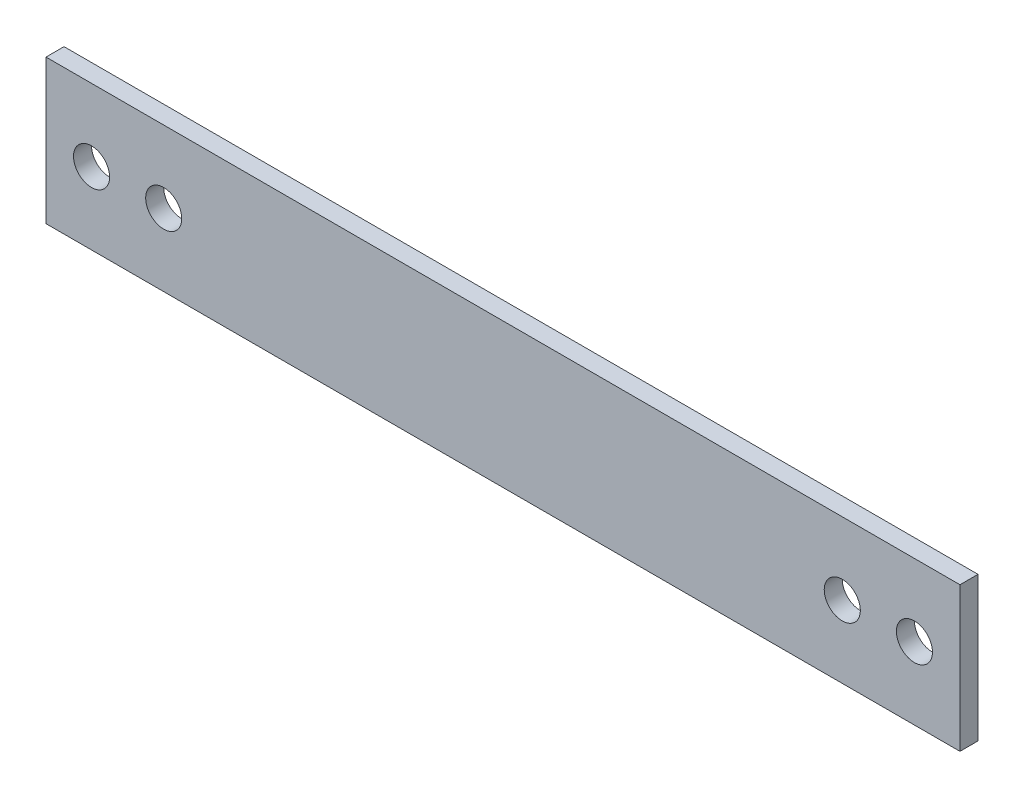
ISO-10303-21;
HEADER;
FILE_DESCRIPTION(('STEP AP214'),'2;1');
FILE_NAME('part.step','',(''),(''),'','','');
FILE_SCHEMA(('AUTOMOTIVE_DESIGN { 1 0 10303 214 1 1 1 1 }'));
ENDSEC;
DATA;
#1=APPLICATION_CONTEXT('core data for automotive mechanical design processes');
#2=APPLICATION_PROTOCOL_DEFINITION('international standard','automotive_design',2000,#1);
#3=PRODUCT_CONTEXT('',#1,'mechanical');
#4=PRODUCT('Part','Part','',(#3));
#5=PRODUCT_RELATED_PRODUCT_CATEGORY('part','',(#4));
#6=PRODUCT_DEFINITION_FORMATION('','',#4);
#7=PRODUCT_DEFINITION_CONTEXT('part definition',#1,'design');
#8=PRODUCT_DEFINITION('design','',#6,#7);
#9=PRODUCT_DEFINITION_SHAPE('','',#8);
#10=(LENGTH_UNIT() NAMED_UNIT(*) SI_UNIT(.MILLI.,.METRE.));
#11=(NAMED_UNIT(*) PLANE_ANGLE_UNIT() SI_UNIT($,.RADIAN.));
#12=(NAMED_UNIT(*) SI_UNIT($,.STERADIAN.) SOLID_ANGLE_UNIT());
#13=UNCERTAINTY_MEASURE_WITH_UNIT(LENGTH_MEASURE(1.E-05),#10,'distance_accuracy_value','');
#14=(GEOMETRIC_REPRESENTATION_CONTEXT(3) GLOBAL_UNCERTAINTY_ASSIGNED_CONTEXT((#13)) GLOBAL_UNIT_ASSIGNED_CONTEXT((#10,
#11,#12)) REPRESENTATION_CONTEXT('',''));
#15=CARTESIAN_POINT('',(0.,0.,0.));
#16=DIRECTION('',(0.,0.,1.));
#17=DIRECTION('',(1.,0.,0.));
#18=AXIS2_PLACEMENT_3D('',#15,#16,#17);
#19=CARTESIAN_POINT('',(0.,0.,4.7625));
#20=DIRECTION('',(0.,0.,-1.));
#21=DIRECTION('',(-1.,0.,0.));
#22=AXIS2_PLACEMENT_3D('',#19,#20,#21);
#23=PLANE('',#22);
#24=DIRECTION('',(0.,1.,0.));
#25=VECTOR('',#24,1.);
#26=CARTESIAN_POINT('',(120.65,-19.05,4.7625));
#27=LINE('',#26,#25);
#28=CARTESIAN_POINT('',(120.65,-19.05,4.7625));
#29=VERTEX_POINT('',#28);
#30=CARTESIAN_POINT('',(120.65,19.05,4.7625));
#31=VERTEX_POINT('',#30);
#32=EDGE_CURVE('E92',#29,#31,#27,.T.);
#33=ORIENTED_EDGE('',*,*,#32,.T.);
#34=DIRECTION('',(-1.,0.,0.));
#35=VECTOR('',#34,1.);
#36=CARTESIAN_POINT('',(-120.65,19.05,4.7625));
#37=LINE('',#36,#35);
#38=CARTESIAN_POINT('',(-120.65,19.05,4.7625));
#39=VERTEX_POINT('',#38);
#40=EDGE_CURVE('E87',#31,#39,#37,.T.);
#41=ORIENTED_EDGE('',*,*,#40,.T.);
#42=DIRECTION('',(0.,-1.,0.));
#43=VECTOR('',#42,1.);
#44=CARTESIAN_POINT('',(-120.65,-19.05,4.7625));
#45=LINE('',#44,#43);
#46=CARTESIAN_POINT('',(-120.65,-19.05,4.7625));
#47=VERTEX_POINT('',#46);
#48=EDGE_CURVE('E90',#39,#47,#45,.T.);
#49=ORIENTED_EDGE('',*,*,#48,.T.);
#50=DIRECTION('',(1.,0.,0.));
#51=VECTOR('',#50,1.);
#52=CARTESIAN_POINT('',(-120.65,-19.05,4.7625));
#53=LINE('',#52,#51);
#54=EDGE_CURVE('E57',#47,#29,#53,.T.);
#55=ORIENTED_EDGE('',*,*,#54,.T.);
#56=EDGE_LOOP('',(#33,#41,#49,#55));
#57=FACE_BOUND('',#56,.T.);
#58=CARTESIAN_POINT('',(-108.625531914894,0.,4.7625));
#59=DIRECTION('',(0.,0.,1.));
#60=DIRECTION('',(1.,0.,0.));
#61=AXIS2_PLACEMENT_3D('',#58,#59,#60);
#62=CIRCLE('',#61,4.7625);
#63=CARTESIAN_POINT('',(-113.388031914894,0.,4.7625));
#64=VERTEX_POINT('',#63);
#65=EDGE_CURVE('E107',#64,#64,#62,.T.);
#66=ORIENTED_EDGE('',*,*,#65,.F.);
#67=EDGE_LOOP('',(#66));
#68=FACE_BOUND('',#67,.T.);
#69=CARTESIAN_POINT('',(-89.5755319148937,0.,4.7625));
#70=DIRECTION('',(0.,0.,1.));
#71=DIRECTION('',(1.,0.,0.));
#72=AXIS2_PLACEMENT_3D('',#69,#70,#71);
#73=CIRCLE('',#72,4.7625);
#74=CARTESIAN_POINT('',(-94.3380319148937,0.,4.7625));
#75=VERTEX_POINT('',#74);
#76=EDGE_CURVE('E122',#75,#75,#73,.T.);
#77=ORIENTED_EDGE('',*,*,#76,.F.);
#78=EDGE_LOOP('',(#77));
#79=FACE_BOUND('',#78,.T.);
#80=CARTESIAN_POINT('',(89.5755319148937,0.,4.7625));
#81=DIRECTION('',(0.,0.,1.));
#82=DIRECTION('',(-1.,0.,0.));
#83=AXIS2_PLACEMENT_3D('',#80,#81,#82);
#84=CIRCLE('',#83,4.7625);
#85=CARTESIAN_POINT('',(84.8130319148937,0.,4.7625));
#86=VERTEX_POINT('',#85);
#87=EDGE_CURVE('E128',#86,#86,#84,.T.);
#88=ORIENTED_EDGE('',*,*,#87,.F.);
#89=EDGE_LOOP('',(#88));
#90=FACE_BOUND('',#89,.T.);
#91=CARTESIAN_POINT('',(108.625531914894,0.,4.7625));
#92=DIRECTION('',(0.,0.,1.));
#93=DIRECTION('',(-1.,0.,0.));
#94=AXIS2_PLACEMENT_3D('',#91,#92,#93);
#95=CIRCLE('',#94,4.7625);
#96=CARTESIAN_POINT('',(103.863031914894,0.,4.7625));
#97=VERTEX_POINT('',#96);
#98=EDGE_CURVE('E134',#97,#97,#95,.T.);
#99=ORIENTED_EDGE('',*,*,#98,.F.);
#100=EDGE_LOOP('',(#99));
#101=FACE_BOUND('',#100,.T.);
#102=ADVANCED_FACE('F40',(#57,#68,#79,#90,#101),#23,.F.);
#103=CARTESIAN_POINT('',(0.,0.,0.));
#104=DIRECTION('',(0.,0.,-1.));
#105=DIRECTION('',(-1.,0.,0.));
#106=AXIS2_PLACEMENT_3D('',#103,#104,#105);
#107=PLANE('',#106);
#108=CARTESIAN_POINT('',(89.5755319148937,0.,0.));
#109=DIRECTION('',(0.,0.,1.));
#110=DIRECTION('',(-1.,0.,0.));
#111=AXIS2_PLACEMENT_3D('',#108,#109,#110);
#112=CIRCLE('',#111,4.7625);
#113=CARTESIAN_POINT('',(84.8130319148937,0.,0.));
#114=VERTEX_POINT('',#113);
#115=EDGE_CURVE('E131',#114,#114,#112,.T.);
#116=ORIENTED_EDGE('',*,*,#115,.T.);
#117=EDGE_LOOP('',(#116));
#118=FACE_BOUND('',#117,.T.);
#119=CARTESIAN_POINT('',(-108.625531914894,0.,0.));
#120=DIRECTION('',(0.,0.,1.));
#121=DIRECTION('',(1.,0.,0.));
#122=AXIS2_PLACEMENT_3D('',#119,#120,#121);
#123=CIRCLE('',#122,4.7625);
#124=CARTESIAN_POINT('',(-113.388031914894,0.,0.));
#125=VERTEX_POINT('',#124);
#126=EDGE_CURVE('E119',#125,#125,#123,.T.);
#127=ORIENTED_EDGE('',*,*,#126,.T.);
#128=EDGE_LOOP('',(#127));
#129=FACE_BOUND('',#128,.T.);
#130=DIRECTION('',(0.,1.,0.));
#131=VECTOR('',#130,1.);
#132=CARTESIAN_POINT('',(120.65,-19.05,0.));
#133=LINE('',#132,#131);
#134=CARTESIAN_POINT('',(120.65,-19.05,0.));
#135=VERTEX_POINT('',#134);
#136=CARTESIAN_POINT('',(120.65,19.05,0.));
#137=VERTEX_POINT('',#136);
#138=EDGE_CURVE('E104',#135,#137,#133,.T.);
#139=ORIENTED_EDGE('',*,*,#138,.F.);
#140=DIRECTION('',(1.,0.,0.));
#141=VECTOR('',#140,1.);
#142=CARTESIAN_POINT('',(-120.65,-19.05,0.));
#143=LINE('',#142,#141);
#144=CARTESIAN_POINT('',(-120.65,-19.05,0.));
#145=VERTEX_POINT('',#144);
#146=EDGE_CURVE('E80',#145,#135,#143,.T.);
#147=ORIENTED_EDGE('',*,*,#146,.F.);
#148=DIRECTION('',(0.,-1.,0.));
#149=VECTOR('',#148,1.);
#150=CARTESIAN_POINT('',(-120.65,-19.05,0.));
#151=LINE('',#150,#149);
#152=CARTESIAN_POINT('',(-120.65,19.05,0.));
#153=VERTEX_POINT('',#152);
#154=EDGE_CURVE('E74',#153,#145,#151,.T.);
#155=ORIENTED_EDGE('',*,*,#154,.F.);
#156=DIRECTION('',(-1.,0.,0.));
#157=VECTOR('',#156,1.);
#158=CARTESIAN_POINT('',(-120.65,19.05,0.));
#159=LINE('',#158,#157);
#160=EDGE_CURVE('E96',#137,#153,#159,.T.);
#161=ORIENTED_EDGE('',*,*,#160,.F.);
#162=EDGE_LOOP('',(#139,#147,#155,#161));
#163=FACE_BOUND('',#162,.T.);
#164=CARTESIAN_POINT('',(-89.5755319148937,0.,0.));
#165=DIRECTION('',(0.,0.,1.));
#166=DIRECTION('',(1.,0.,0.));
#167=AXIS2_PLACEMENT_3D('',#164,#165,#166);
#168=CIRCLE('',#167,4.7625);
#169=CARTESIAN_POINT('',(-94.3380319148937,0.,0.));
#170=VERTEX_POINT('',#169);
#171=EDGE_CURVE('E125',#170,#170,#168,.T.);
#172=ORIENTED_EDGE('',*,*,#171,.T.);
#173=EDGE_LOOP('',(#172));
#174=FACE_BOUND('',#173,.T.);
#175=CARTESIAN_POINT('',(108.625531914894,0.,0.));
#176=DIRECTION('',(0.,0.,1.));
#177=DIRECTION('',(-1.,0.,0.));
#178=AXIS2_PLACEMENT_3D('',#175,#176,#177);
#179=CIRCLE('',#178,4.7625);
#180=CARTESIAN_POINT('',(103.863031914894,0.,0.));
#181=VERTEX_POINT('',#180);
#182=EDGE_CURVE('E137',#181,#181,#179,.T.);
#183=ORIENTED_EDGE('',*,*,#182,.T.);
#184=EDGE_LOOP('',(#183));
#185=FACE_BOUND('',#184,.T.);
#186=ADVANCED_FACE('F115',(#118,#129,#163,#174,#185),#107,.T.);
#187=CARTESIAN_POINT('',(120.65,-19.05,4.7625));
#188=DIRECTION('',(-1.,0.,0.));
#189=DIRECTION('',(0.,0.,1.));
#190=AXIS2_PLACEMENT_3D('',#187,#188,#189);
#191=PLANE('',#190);
#192=ORIENTED_EDGE('',*,*,#138,.T.);
#193=DIRECTION('',(0.,0.,-1.));
#194=VECTOR('',#193,1.);
#195=CARTESIAN_POINT('',(120.65,19.05,4.7625));
#196=LINE('',#195,#194);
#197=EDGE_CURVE('E11',#31,#137,#196,.T.);
#198=ORIENTED_EDGE('',*,*,#197,.F.);
#199=ORIENTED_EDGE('',*,*,#32,.F.);
#200=DIRECTION('',(0.,0.,-1.));
#201=VECTOR('',#200,1.);
#202=CARTESIAN_POINT('',(120.65,-19.05,4.7625));
#203=LINE('',#202,#201);
#204=EDGE_CURVE('E100',#29,#135,#203,.T.);
#205=ORIENTED_EDGE('',*,*,#204,.T.);
#206=EDGE_LOOP('',(#192,#198,#199,#205));
#207=FACE_BOUND('',#206,.T.);
#208=ADVANCED_FACE('F42',(#207),#191,.F.);
#209=CARTESIAN_POINT('',(-120.65,19.05,4.7625));
#210=DIRECTION('',(0.,-1.,0.));
#211=DIRECTION('',(0.,0.,-1.));
#212=AXIS2_PLACEMENT_3D('',#209,#210,#211);
#213=PLANE('',#212);
#214=ORIENTED_EDGE('',*,*,#160,.T.);
#215=DIRECTION('',(0.,0.,-1.));
#216=VECTOR('',#215,1.);
#217=CARTESIAN_POINT('',(-120.65,19.05,4.7625));
#218=LINE('',#217,#216);
#219=EDGE_CURVE('E49',#39,#153,#218,.T.);
#220=ORIENTED_EDGE('',*,*,#219,.F.);
#221=ORIENTED_EDGE('',*,*,#40,.F.);
#222=ORIENTED_EDGE('',*,*,#197,.T.);
#223=EDGE_LOOP('',(#214,#220,#221,#222));
#224=FACE_BOUND('',#223,.T.);
#225=ADVANCED_FACE('F95',(#224),#213,.F.);
#226=CARTESIAN_POINT('',(-120.65,-19.05,4.7625));
#227=DIRECTION('',(1.,0.,0.));
#228=DIRECTION('',(0.,0.,-1.));
#229=AXIS2_PLACEMENT_3D('',#226,#227,#228);
#230=PLANE('',#229);
#231=ORIENTED_EDGE('',*,*,#154,.T.);
#232=DIRECTION('',(0.,0.,-1.));
#233=VECTOR('',#232,1.);
#234=CARTESIAN_POINT('',(-120.65,-19.05,4.7625));
#235=LINE('',#234,#233);
#236=EDGE_CURVE('E97',#47,#145,#235,.T.);
#237=ORIENTED_EDGE('',*,*,#236,.F.);
#238=ORIENTED_EDGE('',*,*,#48,.F.);
#239=ORIENTED_EDGE('',*,*,#219,.T.);
#240=EDGE_LOOP('',(#231,#237,#238,#239));
#241=FACE_BOUND('',#240,.T.);
#242=ADVANCED_FACE('F98',(#241),#230,.F.);
#243=CARTESIAN_POINT('',(-120.65,-19.05,4.7625));
#244=DIRECTION('',(0.,1.,0.));
#245=DIRECTION('',(0.,0.,1.));
#246=AXIS2_PLACEMENT_3D('',#243,#244,#245);
#247=PLANE('',#246);
#248=ORIENTED_EDGE('',*,*,#146,.T.);
#249=ORIENTED_EDGE('',*,*,#204,.F.);
#250=ORIENTED_EDGE('',*,*,#54,.F.);
#251=ORIENTED_EDGE('',*,*,#236,.T.);
#252=EDGE_LOOP('',(#248,#249,#250,#251));
#253=FACE_BOUND('',#252,.T.);
#254=ADVANCED_FACE('F112',(#253),#247,.F.);
#255=CARTESIAN_POINT('',(-108.625531914894,0.,4.7625));
#256=DIRECTION('',(0.,0.,-1.));
#257=DIRECTION('',(-1.,0.,0.));
#258=AXIS2_PLACEMENT_3D('',#255,#256,#257);
#259=CYLINDRICAL_SURFACE('',#258,4.7625);
#260=CARTESIAN_POINT('',(-113.388031914894,0.,4.7625));
#261=CARTESIAN_POINT('',(-113.388031914894,0.,4.712890625));
#262=CARTESIAN_POINT('',(-113.388031914894,0.,4.66328125));
#263=CARTESIAN_POINT('',(-113.388031914894,0.,4.5640625));
#264=CARTESIAN_POINT('',(-113.388031914894,0.,4.514453125));
#265=CARTESIAN_POINT('',(-113.388031914894,0.,4.415234375));
#266=CARTESIAN_POINT('',(-113.388031914894,0.,4.365625));
#267=CARTESIAN_POINT('',(-113.388031914894,0.,4.26640625));
#268=CARTESIAN_POINT('',(-113.388031914894,0.,4.216796875));
#269=CARTESIAN_POINT('',(-113.388031914894,0.,4.117578125));
#270=CARTESIAN_POINT('',(-113.388031914894,0.,4.06796875));
#271=CARTESIAN_POINT('',(-113.388031914894,0.,3.96875));
#272=CARTESIAN_POINT('',(-113.388031914894,0.,3.919140625));
#273=CARTESIAN_POINT('',(-113.388031914894,0.,3.819921875));
#274=CARTESIAN_POINT('',(-113.388031914894,0.,3.7703125));
#275=CARTESIAN_POINT('',(-113.388031914894,0.,3.67109375));
#276=CARTESIAN_POINT('',(-113.388031914894,0.,3.621484375));
#277=CARTESIAN_POINT('',(-113.388031914894,0.,3.522265625));
#278=CARTESIAN_POINT('',(-113.388031914894,0.,3.47265625));
#279=CARTESIAN_POINT('',(-113.388031914894,0.,3.3734375));
#280=CARTESIAN_POINT('',(-113.388031914894,0.,3.323828125));
#281=CARTESIAN_POINT('',(-113.388031914894,0.,3.224609375));
#282=CARTESIAN_POINT('',(-113.388031914894,0.,3.175));
#283=CARTESIAN_POINT('',(-113.388031914894,0.,3.07578125));
#284=CARTESIAN_POINT('',(-113.388031914894,0.,3.026171875));
#285=CARTESIAN_POINT('',(-113.388031914894,0.,2.926953125));
#286=CARTESIAN_POINT('',(-113.388031914894,0.,2.87734375));
#287=CARTESIAN_POINT('',(-113.388031914894,0.,2.778125));
#288=CARTESIAN_POINT('',(-113.388031914894,0.,2.728515625));
#289=CARTESIAN_POINT('',(-113.388031914894,0.,2.629296875));
#290=CARTESIAN_POINT('',(-113.388031914894,0.,2.5796875));
#291=CARTESIAN_POINT('',(-113.388031914894,0.,2.48046875));
#292=CARTESIAN_POINT('',(-113.388031914894,0.,2.430859375));
#293=CARTESIAN_POINT('',(-113.388031914894,0.,2.331640625));
#294=CARTESIAN_POINT('',(-113.388031914894,0.,2.28203125));
#295=CARTESIAN_POINT('',(-113.388031914894,0.,2.1828125));
#296=CARTESIAN_POINT('',(-113.388031914894,0.,2.133203125));
#297=CARTESIAN_POINT('',(-113.388031914894,0.,2.033984375));
#298=CARTESIAN_POINT('',(-113.388031914894,0.,1.984375));
#299=CARTESIAN_POINT('',(-113.388031914894,0.,1.88515625));
#300=CARTESIAN_POINT('',(-113.388031914894,0.,1.835546875));
#301=CARTESIAN_POINT('',(-113.388031914894,0.,1.736328125));
#302=CARTESIAN_POINT('',(-113.388031914894,0.,1.68671875));
#303=CARTESIAN_POINT('',(-113.388031914894,0.,1.5875));
#304=CARTESIAN_POINT('',(-113.388031914894,0.,1.537890625));
#305=CARTESIAN_POINT('',(-113.388031914894,0.,1.438671875));
#306=CARTESIAN_POINT('',(-113.388031914894,0.,1.3890625));
#307=CARTESIAN_POINT('',(-113.388031914894,0.,1.28984375));
#308=CARTESIAN_POINT('',(-113.388031914894,0.,1.240234375));
#309=CARTESIAN_POINT('',(-113.388031914894,0.,1.141015625));
#310=CARTESIAN_POINT('',(-113.388031914894,0.,1.09140625));
#311=CARTESIAN_POINT('',(-113.388031914894,0.,0.992187499999999));
#312=CARTESIAN_POINT('',(-113.388031914894,0.,0.942578124999999));
#313=CARTESIAN_POINT('',(-113.388031914894,0.,0.843359375));
#314=CARTESIAN_POINT('',(-113.388031914894,0.,0.79375));
#315=CARTESIAN_POINT('',(-113.388031914894,0.,0.69453125));
#316=CARTESIAN_POINT('',(-113.388031914894,0.,0.644921875));
#317=CARTESIAN_POINT('',(-113.388031914894,0.,0.545703125));
#318=CARTESIAN_POINT('',(-113.388031914894,0.,0.49609375));
#319=CARTESIAN_POINT('',(-113.388031914894,0.,0.396875));
#320=CARTESIAN_POINT('',(-113.388031914894,0.,0.347265625));
#321=CARTESIAN_POINT('',(-113.388031914894,0.,0.248046875));
#322=CARTESIAN_POINT('',(-113.388031914894,0.,0.1984375));
#323=CARTESIAN_POINT('',(-113.388031914894,0.,0.09921875));
#324=CARTESIAN_POINT('',(-113.388031914894,0.,0.049609375));
#325=CARTESIAN_POINT('',(-113.388031914894,0.,0.));
#326=B_SPLINE_CURVE_WITH_KNOTS('',3,(#260,#261,#262,#263,#264,#265,#266,#267,#268,#269,#270,
#271,#272,#273,#274,#275,#276,#277,#278,#279,#280,#281,#282,#283,#284,#285,#286,#287,#288,#289,
#290,#291,#292,#293,#294,#295,#296,#297,#298,#299,#300,#301,#302,#303,#304,#305,#306,#307,#308,
#309,#310,#311,#312,#313,#314,#315,#316,#317,#318,#319,#320,#321,#322,#323,#324,#325),
.UNSPECIFIED.,.F.,.F.,(4,2,2,2,2,2,2,2,2,2,2,2,2,2,2,2,2,2,2,2,2,2,2,2,2,2,2,2,2,2,2,2,4),(0.,
0.148828125,0.29765625,0.446484375,0.5953125,0.744140625,0.892968750000001,1.041796875,1.190625,
1.339453125,1.48828125,1.637109375,1.7859375,1.934765625,2.08359375,2.232421875,2.38125,
2.530078125,2.67890625,2.827734375,2.9765625,3.125390625,3.27421875,3.423046875,3.571875,
3.720703125,3.86953125,4.018359375,4.1671875,4.316015625,4.46484375,4.613671875,4.7625),.UNSPECIFIED.);
#327=EDGE_CURVE('BSEAM154',#64,#125,#326,.T.);
#328=ORIENTED_EDGE('',*,*,#65,.T.);
#329=ORIENTED_EDGE('',*,*,#126,.F.);
#330=ORIENTED_EDGE('',*,*,#327,.T.);
#331=ORIENTED_EDGE('',*,*,#327,.F.);
#332=EDGE_LOOP('',(#328,#330,#329,#331));
#333=FACE_BOUND('',#332,.T.);
#334=ADVANCED_FACE('F154',(#333),#259,.F.);
#335=CARTESIAN_POINT('',(-89.5755319148937,0.,4.7625));
#336=DIRECTION('',(0.,0.,-1.));
#337=DIRECTION('',(-1.,0.,0.));
#338=AXIS2_PLACEMENT_3D('',#335,#336,#337);
#339=CYLINDRICAL_SURFACE('',#338,4.7625);
#340=CARTESIAN_POINT('',(-94.3380319148937,0.,4.7625));
#341=CARTESIAN_POINT('',(-94.3380319148937,0.,4.712890625));
#342=CARTESIAN_POINT('',(-94.3380319148937,0.,4.66328125));
#343=CARTESIAN_POINT('',(-94.3380319148937,0.,4.5640625));
#344=CARTESIAN_POINT('',(-94.3380319148937,0.,4.514453125));
#345=CARTESIAN_POINT('',(-94.3380319148937,0.,4.415234375));
#346=CARTESIAN_POINT('',(-94.3380319148937,0.,4.365625));
#347=CARTESIAN_POINT('',(-94.3380319148937,0.,4.26640625));
#348=CARTESIAN_POINT('',(-94.3380319148937,0.,4.216796875));
#349=CARTESIAN_POINT('',(-94.3380319148937,0.,4.117578125));
#350=CARTESIAN_POINT('',(-94.3380319148937,0.,4.06796875));
#351=CARTESIAN_POINT('',(-94.3380319148937,0.,3.96875));
#352=CARTESIAN_POINT('',(-94.3380319148937,0.,3.919140625));
#353=CARTESIAN_POINT('',(-94.3380319148937,0.,3.819921875));
#354=CARTESIAN_POINT('',(-94.3380319148937,0.,3.7703125));
#355=CARTESIAN_POINT('',(-94.3380319148937,0.,3.67109375));
#356=CARTESIAN_POINT('',(-94.3380319148937,0.,3.621484375));
#357=CARTESIAN_POINT('',(-94.3380319148937,0.,3.522265625));
#358=CARTESIAN_POINT('',(-94.3380319148937,0.,3.47265625));
#359=CARTESIAN_POINT('',(-94.3380319148937,0.,3.3734375));
#360=CARTESIAN_POINT('',(-94.3380319148937,0.,3.323828125));
#361=CARTESIAN_POINT('',(-94.3380319148937,0.,3.224609375));
#362=CARTESIAN_POINT('',(-94.3380319148937,0.,3.175));
#363=CARTESIAN_POINT('',(-94.3380319148937,0.,3.07578125));
#364=CARTESIAN_POINT('',(-94.3380319148937,0.,3.026171875));
#365=CARTESIAN_POINT('',(-94.3380319148937,0.,2.926953125));
#366=CARTESIAN_POINT('',(-94.3380319148937,0.,2.87734375));
#367=CARTESIAN_POINT('',(-94.3380319148937,0.,2.778125));
#368=CARTESIAN_POINT('',(-94.3380319148937,0.,2.728515625));
#369=CARTESIAN_POINT('',(-94.3380319148937,0.,2.629296875));
#370=CARTESIAN_POINT('',(-94.3380319148937,0.,2.5796875));
#371=CARTESIAN_POINT('',(-94.3380319148937,0.,2.48046875));
#372=CARTESIAN_POINT('',(-94.3380319148937,0.,2.430859375));
#373=CARTESIAN_POINT('',(-94.3380319148937,0.,2.331640625));
#374=CARTESIAN_POINT('',(-94.3380319148937,0.,2.28203125));
#375=CARTESIAN_POINT('',(-94.3380319148937,0.,2.1828125));
#376=CARTESIAN_POINT('',(-94.3380319148937,0.,2.133203125));
#377=CARTESIAN_POINT('',(-94.3380319148937,0.,2.033984375));
#378=CARTESIAN_POINT('',(-94.3380319148937,0.,1.984375));
#379=CARTESIAN_POINT('',(-94.3380319148937,0.,1.88515625));
#380=CARTESIAN_POINT('',(-94.3380319148937,0.,1.835546875));
#381=CARTESIAN_POINT('',(-94.3380319148937,0.,1.736328125));
#382=CARTESIAN_POINT('',(-94.3380319148937,0.,1.68671875));
#383=CARTESIAN_POINT('',(-94.3380319148937,0.,1.5875));
#384=CARTESIAN_POINT('',(-94.3380319148937,0.,1.537890625));
#385=CARTESIAN_POINT('',(-94.3380319148937,0.,1.438671875));
#386=CARTESIAN_POINT('',(-94.3380319148937,0.,1.3890625));
#387=CARTESIAN_POINT('',(-94.3380319148937,0.,1.28984375));
#388=CARTESIAN_POINT('',(-94.3380319148937,0.,1.240234375));
#389=CARTESIAN_POINT('',(-94.3380319148937,0.,1.141015625));
#390=CARTESIAN_POINT('',(-94.3380319148937,0.,1.09140625));
#391=CARTESIAN_POINT('',(-94.3380319148937,0.,0.992187499999999));
#392=CARTESIAN_POINT('',(-94.3380319148937,0.,0.942578124999999));
#393=CARTESIAN_POINT('',(-94.3380319148937,0.,0.843359375));
#394=CARTESIAN_POINT('',(-94.3380319148937,0.,0.79375));
#395=CARTESIAN_POINT('',(-94.3380319148937,0.,0.69453125));
#396=CARTESIAN_POINT('',(-94.3380319148937,0.,0.644921875));
#397=CARTESIAN_POINT('',(-94.3380319148937,0.,0.545703125));
#398=CARTESIAN_POINT('',(-94.3380319148937,0.,0.49609375));
#399=CARTESIAN_POINT('',(-94.3380319148937,0.,0.396875));
#400=CARTESIAN_POINT('',(-94.3380319148937,0.,0.347265625));
#401=CARTESIAN_POINT('',(-94.3380319148937,0.,0.248046875));
#402=CARTESIAN_POINT('',(-94.3380319148937,0.,0.1984375));
#403=CARTESIAN_POINT('',(-94.3380319148937,0.,0.09921875));
#404=CARTESIAN_POINT('',(-94.3380319148937,0.,0.049609375));
#405=CARTESIAN_POINT('',(-94.3380319148937,0.,0.));
#406=B_SPLINE_CURVE_WITH_KNOTS('',3,(#340,#341,#342,#343,#344,#345,#346,#347,#348,#349,#350,
#351,#352,#353,#354,#355,#356,#357,#358,#359,#360,#361,#362,#363,#364,#365,#366,#367,#368,#369,
#370,#371,#372,#373,#374,#375,#376,#377,#378,#379,#380,#381,#382,#383,#384,#385,#386,#387,#388,
#389,#390,#391,#392,#393,#394,#395,#396,#397,#398,#399,#400,#401,#402,#403,#404,#405),
.UNSPECIFIED.,.F.,.F.,(4,2,2,2,2,2,2,2,2,2,2,2,2,2,2,2,2,2,2,2,2,2,2,2,2,2,2,2,2,2,2,2,4),(0.,
0.148828125,0.29765625,0.446484375,0.5953125,0.744140625,0.892968750000001,1.041796875,1.190625,
1.339453125,1.48828125,1.637109375,1.7859375,1.934765625,2.08359375,2.232421875,2.38125,
2.530078125,2.67890625,2.827734375,2.9765625,3.125390625,3.27421875,3.423046875,3.571875,
3.720703125,3.86953125,4.018359375,4.1671875,4.316015625,4.46484375,4.613671875,4.7625),.UNSPECIFIED.);
#407=EDGE_CURVE('BSEAM219',#75,#170,#406,.T.);
#408=ORIENTED_EDGE('',*,*,#76,.T.);
#409=ORIENTED_EDGE('',*,*,#171,.F.);
#410=ORIENTED_EDGE('',*,*,#407,.T.);
#411=ORIENTED_EDGE('',*,*,#407,.F.);
#412=EDGE_LOOP('',(#408,#410,#409,#411));
#413=FACE_BOUND('',#412,.T.);
#414=ADVANCED_FACE('F219',(#413),#339,.F.);
#415=CARTESIAN_POINT('',(89.5755319148937,0.,4.7625));
#416=DIRECTION('',(0.,0.,-1.));
#417=DIRECTION('',(-1.,0.,0.));
#418=AXIS2_PLACEMENT_3D('',#415,#416,#417);
#419=CYLINDRICAL_SURFACE('',#418,4.7625);
#420=CARTESIAN_POINT('',(84.8130319148937,0.,4.7625));
#421=CARTESIAN_POINT('',(84.8130319148937,0.,4.712890625));
#422=CARTESIAN_POINT('',(84.8130319148937,0.,4.66328125));
#423=CARTESIAN_POINT('',(84.8130319148937,0.,4.5640625));
#424=CARTESIAN_POINT('',(84.8130319148937,0.,4.514453125));
#425=CARTESIAN_POINT('',(84.8130319148937,0.,4.415234375));
#426=CARTESIAN_POINT('',(84.8130319148937,0.,4.365625));
#427=CARTESIAN_POINT('',(84.8130319148937,0.,4.26640625));
#428=CARTESIAN_POINT('',(84.8130319148937,0.,4.216796875));
#429=CARTESIAN_POINT('',(84.8130319148937,0.,4.117578125));
#430=CARTESIAN_POINT('',(84.8130319148937,0.,4.06796875));
#431=CARTESIAN_POINT('',(84.8130319148937,0.,3.96875));
#432=CARTESIAN_POINT('',(84.8130319148937,0.,3.919140625));
#433=CARTESIAN_POINT('',(84.8130319148937,0.,3.819921875));
#434=CARTESIAN_POINT('',(84.8130319148937,0.,3.7703125));
#435=CARTESIAN_POINT('',(84.8130319148937,0.,3.67109375));
#436=CARTESIAN_POINT('',(84.8130319148937,0.,3.621484375));
#437=CARTESIAN_POINT('',(84.8130319148937,0.,3.522265625));
#438=CARTESIAN_POINT('',(84.8130319148937,0.,3.47265625));
#439=CARTESIAN_POINT('',(84.8130319148937,0.,3.3734375));
#440=CARTESIAN_POINT('',(84.8130319148937,0.,3.323828125));
#441=CARTESIAN_POINT('',(84.8130319148937,0.,3.224609375));
#442=CARTESIAN_POINT('',(84.8130319148937,0.,3.175));
#443=CARTESIAN_POINT('',(84.8130319148937,0.,3.07578125));
#444=CARTESIAN_POINT('',(84.8130319148937,0.,3.026171875));
#445=CARTESIAN_POINT('',(84.8130319148937,0.,2.926953125));
#446=CARTESIAN_POINT('',(84.8130319148937,0.,2.87734375));
#447=CARTESIAN_POINT('',(84.8130319148937,0.,2.778125));
#448=CARTESIAN_POINT('',(84.8130319148937,0.,2.728515625));
#449=CARTESIAN_POINT('',(84.8130319148937,0.,2.629296875));
#450=CARTESIAN_POINT('',(84.8130319148937,0.,2.5796875));
#451=CARTESIAN_POINT('',(84.8130319148937,0.,2.48046875));
#452=CARTESIAN_POINT('',(84.8130319148937,0.,2.430859375));
#453=CARTESIAN_POINT('',(84.8130319148937,0.,2.331640625));
#454=CARTESIAN_POINT('',(84.8130319148937,0.,2.28203125));
#455=CARTESIAN_POINT('',(84.8130319148937,0.,2.1828125));
#456=CARTESIAN_POINT('',(84.8130319148937,0.,2.133203125));
#457=CARTESIAN_POINT('',(84.8130319148937,0.,2.033984375));
#458=CARTESIAN_POINT('',(84.8130319148937,0.,1.984375));
#459=CARTESIAN_POINT('',(84.8130319148937,0.,1.88515625));
#460=CARTESIAN_POINT('',(84.8130319148937,0.,1.835546875));
#461=CARTESIAN_POINT('',(84.8130319148937,0.,1.736328125));
#462=CARTESIAN_POINT('',(84.8130319148937,0.,1.68671875));
#463=CARTESIAN_POINT('',(84.8130319148937,0.,1.5875));
#464=CARTESIAN_POINT('',(84.8130319148937,0.,1.537890625));
#465=CARTESIAN_POINT('',(84.8130319148937,0.,1.438671875));
#466=CARTESIAN_POINT('',(84.8130319148937,0.,1.3890625));
#467=CARTESIAN_POINT('',(84.8130319148937,0.,1.28984375));
#468=CARTESIAN_POINT('',(84.8130319148937,0.,1.240234375));
#469=CARTESIAN_POINT('',(84.8130319148937,0.,1.141015625));
#470=CARTESIAN_POINT('',(84.8130319148937,0.,1.09140625));
#471=CARTESIAN_POINT('',(84.8130319148937,0.,0.992187499999999));
#472=CARTESIAN_POINT('',(84.8130319148937,0.,0.942578124999999));
#473=CARTESIAN_POINT('',(84.8130319148937,0.,0.843359375));
#474=CARTESIAN_POINT('',(84.8130319148937,0.,0.79375));
#475=CARTESIAN_POINT('',(84.8130319148937,0.,0.69453125));
#476=CARTESIAN_POINT('',(84.8130319148937,0.,0.644921875));
#477=CARTESIAN_POINT('',(84.8130319148937,0.,0.545703125));
#478=CARTESIAN_POINT('',(84.8130319148937,0.,0.49609375));
#479=CARTESIAN_POINT('',(84.8130319148937,0.,0.396875));
#480=CARTESIAN_POINT('',(84.8130319148937,0.,0.347265625));
#481=CARTESIAN_POINT('',(84.8130319148937,0.,0.248046875));
#482=CARTESIAN_POINT('',(84.8130319148937,0.,0.1984375));
#483=CARTESIAN_POINT('',(84.8130319148937,0.,0.09921875));
#484=CARTESIAN_POINT('',(84.8130319148937,0.,0.049609375));
#485=CARTESIAN_POINT('',(84.8130319148937,0.,0.));
#486=B_SPLINE_CURVE_WITH_KNOTS('',3,(#420,#421,#422,#423,#424,#425,#426,#427,#428,#429,#430,
#431,#432,#433,#434,#435,#436,#437,#438,#439,#440,#441,#442,#443,#444,#445,#446,#447,#448,#449,
#450,#451,#452,#453,#454,#455,#456,#457,#458,#459,#460,#461,#462,#463,#464,#465,#466,#467,#468,
#469,#470,#471,#472,#473,#474,#475,#476,#477,#478,#479,#480,#481,#482,#483,#484,#485),
.UNSPECIFIED.,.F.,.F.,(4,2,2,2,2,2,2,2,2,2,2,2,2,2,2,2,2,2,2,2,2,2,2,2,2,2,2,2,2,2,2,2,4),(0.,
0.148828125,0.29765625,0.446484375,0.5953125,0.744140625,0.892968750000001,1.041796875,1.190625,
1.339453125,1.48828125,1.637109375,1.7859375,1.934765625,2.08359375,2.232421875,2.38125,
2.530078125,2.67890625,2.827734375,2.9765625,3.125390625,3.27421875,3.423046875,3.571875,
3.720703125,3.86953125,4.018359375,4.1671875,4.316015625,4.46484375,4.613671875,4.7625),.UNSPECIFIED.);
#487=EDGE_CURVE('BSEAM230',#86,#114,#486,.T.);
#488=ORIENTED_EDGE('',*,*,#87,.T.);
#489=ORIENTED_EDGE('',*,*,#115,.F.);
#490=ORIENTED_EDGE('',*,*,#487,.T.);
#491=ORIENTED_EDGE('',*,*,#487,.F.);
#492=EDGE_LOOP('',(#488,#490,#489,#491));
#493=FACE_BOUND('',#492,.T.);
#494=ADVANCED_FACE('F230',(#493),#419,.F.);
#495=CARTESIAN_POINT('',(108.625531914894,0.,4.7625));
#496=DIRECTION('',(0.,0.,-1.));
#497=DIRECTION('',(-1.,0.,0.));
#498=AXIS2_PLACEMENT_3D('',#495,#496,#497);
#499=CYLINDRICAL_SURFACE('',#498,4.7625);
#500=CARTESIAN_POINT('',(103.863031914894,0.,4.7625));
#501=CARTESIAN_POINT('',(103.863031914894,0.,4.712890625));
#502=CARTESIAN_POINT('',(103.863031914894,0.,4.66328125));
#503=CARTESIAN_POINT('',(103.863031914894,0.,4.5640625));
#504=CARTESIAN_POINT('',(103.863031914894,0.,4.514453125));
#505=CARTESIAN_POINT('',(103.863031914894,0.,4.415234375));
#506=CARTESIAN_POINT('',(103.863031914894,0.,4.365625));
#507=CARTESIAN_POINT('',(103.863031914894,0.,4.26640625));
#508=CARTESIAN_POINT('',(103.863031914894,0.,4.216796875));
#509=CARTESIAN_POINT('',(103.863031914894,0.,4.117578125));
#510=CARTESIAN_POINT('',(103.863031914894,0.,4.06796875));
#511=CARTESIAN_POINT('',(103.863031914894,0.,3.96875));
#512=CARTESIAN_POINT('',(103.863031914894,0.,3.919140625));
#513=CARTESIAN_POINT('',(103.863031914894,0.,3.819921875));
#514=CARTESIAN_POINT('',(103.863031914894,0.,3.7703125));
#515=CARTESIAN_POINT('',(103.863031914894,0.,3.67109375));
#516=CARTESIAN_POINT('',(103.863031914894,0.,3.621484375));
#517=CARTESIAN_POINT('',(103.863031914894,0.,3.522265625));
#518=CARTESIAN_POINT('',(103.863031914894,0.,3.47265625));
#519=CARTESIAN_POINT('',(103.863031914894,0.,3.3734375));
#520=CARTESIAN_POINT('',(103.863031914894,0.,3.323828125));
#521=CARTESIAN_POINT('',(103.863031914894,0.,3.224609375));
#522=CARTESIAN_POINT('',(103.863031914894,0.,3.175));
#523=CARTESIAN_POINT('',(103.863031914894,0.,3.07578125));
#524=CARTESIAN_POINT('',(103.863031914894,0.,3.026171875));
#525=CARTESIAN_POINT('',(103.863031914894,0.,2.926953125));
#526=CARTESIAN_POINT('',(103.863031914894,0.,2.87734375));
#527=CARTESIAN_POINT('',(103.863031914894,0.,2.778125));
#528=CARTESIAN_POINT('',(103.863031914894,0.,2.728515625));
#529=CARTESIAN_POINT('',(103.863031914894,0.,2.629296875));
#530=CARTESIAN_POINT('',(103.863031914894,0.,2.5796875));
#531=CARTESIAN_POINT('',(103.863031914894,0.,2.48046875));
#532=CARTESIAN_POINT('',(103.863031914894,0.,2.430859375));
#533=CARTESIAN_POINT('',(103.863031914894,0.,2.331640625));
#534=CARTESIAN_POINT('',(103.863031914894,0.,2.28203125));
#535=CARTESIAN_POINT('',(103.863031914894,0.,2.1828125));
#536=CARTESIAN_POINT('',(103.863031914894,0.,2.133203125));
#537=CARTESIAN_POINT('',(103.863031914894,0.,2.033984375));
#538=CARTESIAN_POINT('',(103.863031914894,0.,1.984375));
#539=CARTESIAN_POINT('',(103.863031914894,0.,1.88515625));
#540=CARTESIAN_POINT('',(103.863031914894,0.,1.835546875));
#541=CARTESIAN_POINT('',(103.863031914894,0.,1.736328125));
#542=CARTESIAN_POINT('',(103.863031914894,0.,1.68671875));
#543=CARTESIAN_POINT('',(103.863031914894,0.,1.5875));
#544=CARTESIAN_POINT('',(103.863031914894,0.,1.537890625));
#545=CARTESIAN_POINT('',(103.863031914894,0.,1.438671875));
#546=CARTESIAN_POINT('',(103.863031914894,0.,1.3890625));
#547=CARTESIAN_POINT('',(103.863031914894,0.,1.28984375));
#548=CARTESIAN_POINT('',(103.863031914894,0.,1.240234375));
#549=CARTESIAN_POINT('',(103.863031914894,0.,1.141015625));
#550=CARTESIAN_POINT('',(103.863031914894,0.,1.09140625));
#551=CARTESIAN_POINT('',(103.863031914894,0.,0.992187499999999));
#552=CARTESIAN_POINT('',(103.863031914894,0.,0.942578124999999));
#553=CARTESIAN_POINT('',(103.863031914894,0.,0.843359375));
#554=CARTESIAN_POINT('',(103.863031914894,0.,0.79375));
#555=CARTESIAN_POINT('',(103.863031914894,0.,0.69453125));
#556=CARTESIAN_POINT('',(103.863031914894,0.,0.644921875));
#557=CARTESIAN_POINT('',(103.863031914894,0.,0.545703125));
#558=CARTESIAN_POINT('',(103.863031914894,0.,0.49609375));
#559=CARTESIAN_POINT('',(103.863031914894,0.,0.396875));
#560=CARTESIAN_POINT('',(103.863031914894,0.,0.347265625));
#561=CARTESIAN_POINT('',(103.863031914894,0.,0.248046875));
#562=CARTESIAN_POINT('',(103.863031914894,0.,0.1984375));
#563=CARTESIAN_POINT('',(103.863031914894,0.,0.09921875));
#564=CARTESIAN_POINT('',(103.863031914894,0.,0.049609375));
#565=CARTESIAN_POINT('',(103.863031914894,0.,0.));
#566=B_SPLINE_CURVE_WITH_KNOTS('',3,(#500,#501,#502,#503,#504,#505,#506,#507,#508,#509,#510,
#511,#512,#513,#514,#515,#516,#517,#518,#519,#520,#521,#522,#523,#524,#525,#526,#527,#528,#529,
#530,#531,#532,#533,#534,#535,#536,#537,#538,#539,#540,#541,#542,#543,#544,#545,#546,#547,#548,
#549,#550,#551,#552,#553,#554,#555,#556,#557,#558,#559,#560,#561,#562,#563,#564,#565),
.UNSPECIFIED.,.F.,.F.,(4,2,2,2,2,2,2,2,2,2,2,2,2,2,2,2,2,2,2,2,2,2,2,2,2,2,2,2,2,2,2,2,4),(0.,
0.148828125,0.29765625,0.446484375,0.5953125,0.744140625,0.892968750000001,1.041796875,1.190625,
1.339453125,1.48828125,1.637109375,1.7859375,1.934765625,2.08359375,2.232421875,2.38125,
2.530078125,2.67890625,2.827734375,2.9765625,3.125390625,3.27421875,3.423046875,3.571875,
3.720703125,3.86953125,4.018359375,4.1671875,4.316015625,4.46484375,4.613671875,4.7625),.UNSPECIFIED.);
#567=EDGE_CURVE('BSEAM143',#97,#181,#566,.T.);
#568=ORIENTED_EDGE('',*,*,#98,.T.);
#569=ORIENTED_EDGE('',*,*,#182,.F.);
#570=ORIENTED_EDGE('',*,*,#567,.T.);
#571=ORIENTED_EDGE('',*,*,#567,.F.);
#572=EDGE_LOOP('',(#568,#570,#569,#571));
#573=FACE_BOUND('',#572,.T.);
#574=ADVANCED_FACE('F143',(#573),#499,.F.);
#575=CLOSED_SHELL('',(#102,#186,#208,#225,#242,#254,#334,#414,#494,#574));
#576=MANIFOLD_SOLID_BREP('B2',#575);
#577=ADVANCED_BREP_SHAPE_REPRESENTATION('',(#18,#576),#14);
#578=SHAPE_DEFINITION_REPRESENTATION(#9,#577);
ENDSEC;
END-ISO-10303-21;
